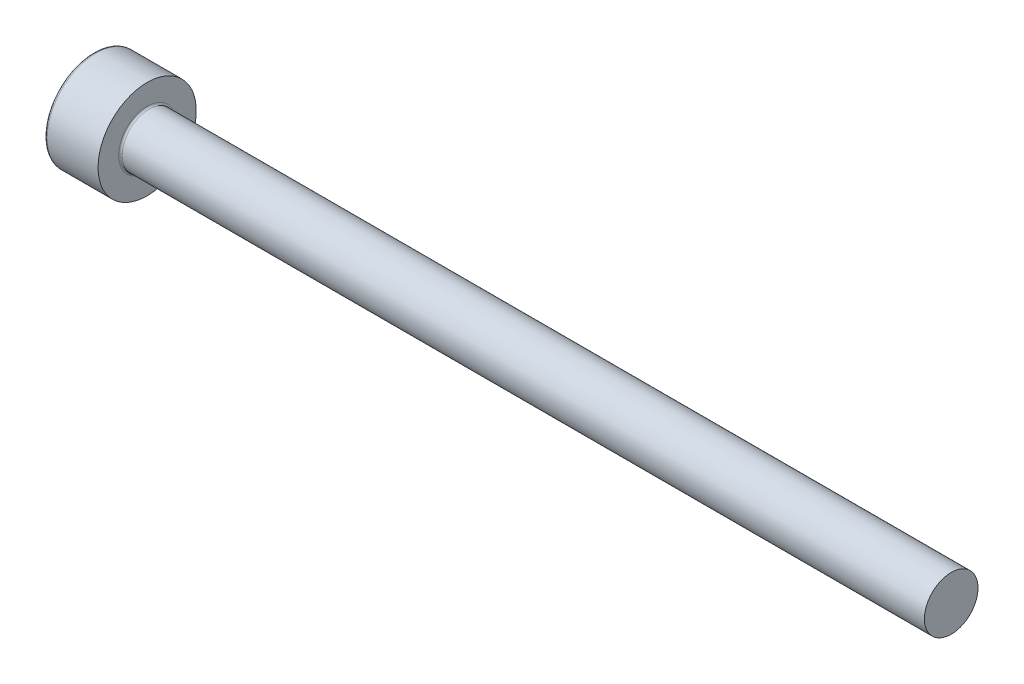
ISO-10303-21;
HEADER;
FILE_DESCRIPTION(('STEP AP214'),'2;1');
FILE_NAME('part.step','',(''),(''),'','','');
FILE_SCHEMA(('AUTOMOTIVE_DESIGN { 1 0 10303 214 1 1 1 1 }'));
ENDSEC;
DATA;
#1=APPLICATION_CONTEXT('core data for automotive mechanical design processes');
#2=APPLICATION_PROTOCOL_DEFINITION('international standard','automotive_design',2000,#1);
#3=PRODUCT_CONTEXT('',#1,'mechanical');
#4=PRODUCT('Part','Part','',(#3));
#5=PRODUCT_RELATED_PRODUCT_CATEGORY('part','',(#4));
#6=PRODUCT_DEFINITION_FORMATION('','',#4);
#7=PRODUCT_DEFINITION_CONTEXT('part definition',#1,'design');
#8=PRODUCT_DEFINITION('design','',#6,#7);
#9=PRODUCT_DEFINITION_SHAPE('','',#8);
#10=(LENGTH_UNIT() NAMED_UNIT(*) SI_UNIT(.MILLI.,.METRE.));
#11=(NAMED_UNIT(*) PLANE_ANGLE_UNIT() SI_UNIT($,.RADIAN.));
#12=(NAMED_UNIT(*) SI_UNIT($,.STERADIAN.) SOLID_ANGLE_UNIT());
#13=UNCERTAINTY_MEASURE_WITH_UNIT(LENGTH_MEASURE(1.E-05),#10,'distance_accuracy_value','');
#14=(GEOMETRIC_REPRESENTATION_CONTEXT(3) GLOBAL_UNCERTAINTY_ASSIGNED_CONTEXT((#13)) GLOBAL_UNIT_ASSIGNED_CONTEXT((#10,
#11,#12)) REPRESENTATION_CONTEXT('',''));
#15=CARTESIAN_POINT('',(0.,0.,0.));
#16=DIRECTION('',(0.,0.,1.));
#17=DIRECTION('',(1.,0.,0.));
#18=AXIS2_PLACEMENT_3D('',#15,#16,#17);
#19=CARTESIAN_POINT('',(-64.4045928047759,8.79516449896665,-40.4453986422559));
#20=DIRECTION('',(-1.,0.,0.));
#21=DIRECTION('',(0.,0.,1.));
#22=AXIS2_PLACEMENT_3D('',#19,#20,#21);
#23=CYLINDRICAL_SURFACE('',#22,1.49999999999999);
#24=CARTESIAN_POINT('',(-29.5545928047759,8.79516449896665,-40.4453986422559));
#25=DIRECTION('',(1.,0.,0.));
#26=DIRECTION('',(0.,0.,-1.));
#27=AXIS2_PLACEMENT_3D('',#24,#25,#26);
#28=CIRCLE('',#27,1.49999999999999);
#29=CARTESIAN_POINT('',(-29.5545928047759,8.79516449896665,-41.9453986422559));
#30=VERTEX_POINT('',#29);
#31=EDGE_CURVE('E147',#30,#30,#28,.T.);
#32=ORIENTED_EDGE('',*,*,#31,.T.);
#33=EDGE_LOOP('',(#32));
#34=FACE_BOUND('',#33,.T.);
#35=CARTESIAN_POINT('',(15.3454071952241,8.79516449896665,-40.4453986422559));
#36=DIRECTION('',(1.,0.,0.));
#37=DIRECTION('',(0.,0.,-1.));
#38=AXIS2_PLACEMENT_3D('',#35,#36,#37);
#39=CIRCLE('',#38,1.49999999999999);
#40=CARTESIAN_POINT('',(15.3454071952241,8.79516449896665,-41.9453986422559));
#41=VERTEX_POINT('',#40);
#42=EDGE_CURVE('E12',#41,#41,#39,.F.);
#43=ORIENTED_EDGE('',*,*,#42,.T.);
#44=EDGE_LOOP('',(#43));
#45=FACE_BOUND('',#44,.T.);
#46=ADVANCED_FACE('F33',(#34,#45),#23,.T.);
#47=CARTESIAN_POINT('',(-32.6545928047759,8.79516449896665,-40.4453986422559));
#48=DIRECTION('',(-1.,0.,0.));
#49=DIRECTION('',(0.,0.,1.));
#50=AXIS2_PLACEMENT_3D('',#47,#48,#49);
#51=PLANE('',#50);
#52=DIRECTION('',(0.,-0.499999999999998,0.866025403784439));
#53=VECTOR('',#52,1.);
#54=CARTESIAN_POINT('',(-32.6545928047759,10.2731811880921,-40.4453986422559));
#55=LINE('',#54,#53);
#56=CARTESIAN_POINT('',(-32.6545928047759,10.2731811880921,-40.4453986422559));
#57=VERTEX_POINT('',#56);
#58=CARTESIAN_POINT('',(-32.6545928047759,9.53417284352937,-39.1653986422559));
#59=VERTEX_POINT('',#58);
#60=EDGE_CURVE('E258',#57,#59,#55,.T.);
#61=ORIENTED_EDGE('',*,*,#60,.T.);
#62=DIRECTION('',(0.,1.,0.));
#63=VECTOR('',#62,1.);
#64=CARTESIAN_POINT('',(-32.6545928047759,8.05615615440393,-39.1653986422559));
#65=LINE('',#64,#63);
#66=CARTESIAN_POINT('',(-32.6545928047759,8.05615615440393,-39.1653986422559));
#67=VERTEX_POINT('',#66);
#68=EDGE_CURVE('E129',#67,#59,#65,.T.);
#69=ORIENTED_EDGE('',*,*,#68,.F.);
#70=DIRECTION('',(0.,-0.500000000000001,-0.866025403784438));
#71=VECTOR('',#70,1.);
#72=CARTESIAN_POINT('',(-32.6545928047759,8.05615615440393,-39.1653986422559));
#73=LINE('',#72,#71);
#74=CARTESIAN_POINT('',(-32.6545928047759,7.31714780984121,-40.4453986422559));
#75=VERTEX_POINT('',#74);
#76=EDGE_CURVE('E261',#67,#75,#73,.T.);
#77=ORIENTED_EDGE('',*,*,#76,.T.);
#78=DIRECTION('',(0.,0.499999999999998,-0.866025403784439));
#79=VECTOR('',#78,1.);
#80=CARTESIAN_POINT('',(-32.6545928047759,7.31714780984121,-40.4453986422559));
#81=LINE('',#80,#79);
#82=CARTESIAN_POINT('',(-32.6545928047759,8.05615615440393,-41.7253986422559));
#83=VERTEX_POINT('',#82);
#84=EDGE_CURVE('E264',#75,#83,#81,.T.);
#85=ORIENTED_EDGE('',*,*,#84,.T.);
#86=DIRECTION('',(0.,-1.,0.));
#87=VECTOR('',#86,1.);
#88=CARTESIAN_POINT('',(-32.6545928047759,9.53417284352937,-41.7253986422559));
#89=LINE('',#88,#87);
#90=CARTESIAN_POINT('',(-32.6545928047759,9.53417284352937,-41.7253986422559));
#91=VERTEX_POINT('',#90);
#92=EDGE_CURVE('E267',#91,#83,#89,.T.);
#93=ORIENTED_EDGE('',*,*,#92,.F.);
#94=DIRECTION('',(0.,-0.500000000000001,-0.866025403784438));
#95=VECTOR('',#94,1.);
#96=CARTESIAN_POINT('',(-32.6545928047759,10.2731811880921,-40.4453986422559));
#97=LINE('',#96,#95);
#98=EDGE_CURVE('E124',#57,#91,#97,.T.);
#99=ORIENTED_EDGE('',*,*,#98,.F.);
#100=EDGE_LOOP('',(#61,#69,#77,#85,#93,#99));
#101=FACE_BOUND('',#100,.T.);
#102=CARTESIAN_POINT('',(-32.6545928047759,8.79516449896665,-40.4453986422559));
#103=DIRECTION('',(-1.,0.,0.));
#104=DIRECTION('',(0.,0.,1.));
#105=AXIS2_PLACEMENT_3D('',#102,#103,#104);
#106=CIRCLE('',#105,2.6);
#107=CARTESIAN_POINT('',(-32.6545928047759,8.79516449896665,-37.8453986422559));
#108=VERTEX_POINT('',#107);
#109=EDGE_CURVE('E150',#108,#108,#106,.T.);
#110=ORIENTED_EDGE('',*,*,#109,.T.);
#111=EDGE_LOOP('',(#110));
#112=FACE_BOUND('',#111,.T.);
#113=ADVANCED_FACE('F164',(#101,#112),#51,.T.);
#114=CARTESIAN_POINT('',(-64.4045928047759,8.79516449896665,-40.4453986422559));
#115=DIRECTION('',(-1.,0.,0.));
#116=DIRECTION('',(0.,0.,1.));
#117=AXIS2_PLACEMENT_3D('',#114,#115,#116);
#118=CYLINDRICAL_SURFACE('',#117,2.75);
#119=CARTESIAN_POINT('',(-32.5045928047759,8.79516449896665,-40.4453986422559));
#120=DIRECTION('',(-1.,0.,0.));
#121=DIRECTION('',(0.,0.,1.));
#122=AXIS2_PLACEMENT_3D('',#119,#120,#121);
#123=CIRCLE('',#122,2.75);
#124=CARTESIAN_POINT('',(-32.5045928047759,8.79516449896665,-37.6953986422559));
#125=VERTEX_POINT('',#124);
#126=EDGE_CURVE('E41',#125,#125,#123,.F.);
#127=ORIENTED_EDGE('',*,*,#126,.T.);
#128=EDGE_LOOP('',(#127));
#129=FACE_BOUND('',#128,.T.);
#130=CARTESIAN_POINT('',(-29.6545928047759,8.79516449896665,-40.4453986422559));
#131=DIRECTION('',(-1.,0.,0.));
#132=DIRECTION('',(0.,0.,1.));
#133=AXIS2_PLACEMENT_3D('',#130,#131,#132);
#134=CIRCLE('',#133,2.75);
#135=CARTESIAN_POINT('',(-29.6545928047759,8.79516449896665,-37.6953986422559));
#136=VERTEX_POINT('',#135);
#137=EDGE_CURVE('E140',#136,#136,#134,.T.);
#138=ORIENTED_EDGE('',*,*,#137,.T.);
#139=EDGE_LOOP('',(#138));
#140=FACE_BOUND('',#139,.T.);
#141=ADVANCED_FACE('F155',(#129,#140),#118,.T.);
#142=CARTESIAN_POINT('',(-29.6545928047759,11.5451644989667,-40.4453986422559));
#143=DIRECTION('',(1.,0.,0.));
#144=DIRECTION('',(0.,0.,-1.));
#145=AXIS2_PLACEMENT_3D('',#142,#143,#144);
#146=PLANE('',#145);
#147=CARTESIAN_POINT('',(-29.6545928047759,8.79516449896665,-40.4453986422559));
#148=DIRECTION('',(1.,0.,0.));
#149=DIRECTION('',(0.,0.,-1.));
#150=AXIS2_PLACEMENT_3D('',#147,#148,#149);
#151=CIRCLE('',#150,1.59999999999999);
#152=CARTESIAN_POINT('',(-29.6545928047759,8.79516449896665,-42.0453986422559));
#153=VERTEX_POINT('',#152);
#154=EDGE_CURVE('E144',#153,#153,#151,.F.);
#155=ORIENTED_EDGE('',*,*,#154,.T.);
#156=EDGE_LOOP('',(#155));
#157=FACE_BOUND('',#156,.T.);
#158=ORIENTED_EDGE('',*,*,#137,.F.);
#159=EDGE_LOOP('',(#158));
#160=FACE_BOUND('',#159,.T.);
#161=ADVANCED_FACE('F172',(#157,#160),#146,.T.);
#162=CARTESIAN_POINT('',(15.3454071952241,10.0146644989667,-40.4453986422559));
#163=DIRECTION('',(1.,0.,0.));
#164=DIRECTION('',(0.,0.,-1.));
#165=AXIS2_PLACEMENT_3D('',#162,#163,#164);
#166=PLANE('',#165);
#167=ORIENTED_EDGE('',*,*,#42,.F.);
#168=EDGE_LOOP('',(#167));
#169=FACE_BOUND('',#168,.T.);
#170=ADVANCED_FACE('F35',(#169),#166,.T.);
#171=CARTESIAN_POINT('',(-29.5545928047759,8.79516449896665,-40.4453986422559));
#172=DIRECTION('',(1.,0.,0.));
#173=DIRECTION('',(0.,0.,-1.));
#174=AXIS2_PLACEMENT_3D('',#171,#172,#173);
#175=TOROIDAL_SURFACE('',#174,1.59999999999999,0.1);
#176=ORIENTED_EDGE('',*,*,#31,.F.);
#177=EDGE_LOOP('',(#176));
#178=FACE_BOUND('',#177,.T.);
#179=ORIENTED_EDGE('',*,*,#154,.F.);
#180=EDGE_LOOP('',(#179));
#181=FACE_BOUND('',#180,.T.);
#182=ADVANCED_FACE('F161',(#178,#181),#175,.F.);
#183=CARTESIAN_POINT('',(-32.5045928047759,8.79516449896665,-40.4453986422559));
#184=DIRECTION('',(-1.,0.,0.));
#185=DIRECTION('',(0.,0.,1.));
#186=AXIS2_PLACEMENT_3D('',#183,#184,#185);
#187=TOROIDAL_SURFACE('',#186,2.6,0.15);
#188=ORIENTED_EDGE('',*,*,#126,.F.);
#189=EDGE_LOOP('',(#188));
#190=FACE_BOUND('',#189,.T.);
#191=ORIENTED_EDGE('',*,*,#109,.F.);
#192=EDGE_LOOP('',(#191));
#193=FACE_BOUND('',#192,.T.);
#194=ADVANCED_FACE('F158',(#190,#193),#187,.T.);
#195=CARTESIAN_POINT('',(-31.3545928047759,10.2731811880921,-40.4453986422559));
#196=DIRECTION('',(0.,-0.86602540378444,-0.499999999999998));
#197=DIRECTION('',(0.,0.499999999999998,-0.86602540378444));
#198=AXIS2_PLACEMENT_3D('',#195,#196,#197);
#199=PLANE('',#198);
#200=ORIENTED_EDGE('',*,*,#60,.F.);
#201=DIRECTION('',(-1.,0.,0.));
#202=VECTOR('',#201,1.);
#203=CARTESIAN_POINT('',(-31.3545928047759,10.2731811880921,-40.4453986422559));
#204=LINE('',#203,#202);
#205=CARTESIAN_POINT('',(-31.3545928047759,10.2731811880921,-40.4453986422559));
#206=VERTEX_POINT('',#205);
#207=EDGE_CURVE('E248',#206,#57,#204,.T.);
#208=ORIENTED_EDGE('',*,*,#207,.F.);
#209=DIRECTION('',(0.,-0.499999999999998,0.866025403784439));
#210=VECTOR('',#209,1.);
#211=CARTESIAN_POINT('',(-31.3545928047759,10.2731811880921,-40.4453986422559));
#212=LINE('',#211,#210);
#213=CARTESIAN_POINT('',(-31.3545928047759,9.90367701581073,-39.8053986422559));
#214=VERTEX_POINT('',#213);
#215=EDGE_CURVE('E116',#206,#214,#212,.T.);
#216=ORIENTED_EDGE('',*,*,#215,.T.);
#217=CARTESIAN_POINT('',(-31.3545928047759,9.53417284352937,-39.1653986422559));
#218=VERTEX_POINT('',#217);
#219=EDGE_CURVE('E107',#214,#218,#212,.T.);
#220=ORIENTED_EDGE('',*,*,#219,.T.);
#221=DIRECTION('',(-1.,0.,0.));
#222=VECTOR('',#221,1.);
#223=CARTESIAN_POINT('',(-31.3545928047759,9.53417284352937,-39.1653986422559));
#224=LINE('',#223,#222);
#225=EDGE_CURVE('E121',#218,#59,#224,.T.);
#226=ORIENTED_EDGE('',*,*,#225,.T.);
#227=EDGE_LOOP('',(#200,#208,#216,#220,#226));
#228=FACE_BOUND('',#227,.T.);
#229=ADVANCED_FACE('F120',(#228),#199,.T.);
#230=CARTESIAN_POINT('',(-31.3545928047759,8.05615615440393,-39.1653986422559));
#231=DIRECTION('',(0.,0.,1.));
#232=DIRECTION('',(0.,-1.,0.));
#233=AXIS2_PLACEMENT_3D('',#230,#231,#232);
#234=PLANE('',#233);
#235=ORIENTED_EDGE('',*,*,#68,.T.);
#236=ORIENTED_EDGE('',*,*,#225,.F.);
#237=DIRECTION('',(0.,1.,0.));
#238=VECTOR('',#237,1.);
#239=CARTESIAN_POINT('',(-31.3545928047759,8.05615615440393,-39.1653986422559));
#240=LINE('',#239,#238);
#241=CARTESIAN_POINT('',(-31.3545928047759,8.79516449896665,-39.1653986422559));
#242=VERTEX_POINT('',#241);
#243=EDGE_CURVE('E104',#242,#218,#240,.T.);
#244=ORIENTED_EDGE('',*,*,#243,.F.);
#245=CARTESIAN_POINT('',(-31.3545928047759,8.05615615440393,-39.1653986422559));
#246=VERTEX_POINT('',#245);
#247=EDGE_CURVE('E115',#246,#242,#240,.T.);
#248=ORIENTED_EDGE('',*,*,#247,.F.);
#249=DIRECTION('',(-1.,0.,0.));
#250=VECTOR('',#249,1.);
#251=CARTESIAN_POINT('',(-31.3545928047759,8.05615615440393,-39.1653986422559));
#252=LINE('',#251,#250);
#253=EDGE_CURVE('E131',#246,#67,#252,.T.);
#254=ORIENTED_EDGE('',*,*,#253,.T.);
#255=EDGE_LOOP('',(#235,#236,#244,#248,#254));
#256=FACE_BOUND('',#255,.T.);
#257=ADVANCED_FACE('F126',(#256),#234,.F.);
#258=CARTESIAN_POINT('',(-31.3545928047759,8.05615615440393,-39.1653986422559));
#259=DIRECTION('',(0.,0.866025403784438,-0.500000000000001));
#260=DIRECTION('',(0.,0.500000000000001,0.866025403784438));
#261=AXIS2_PLACEMENT_3D('',#258,#259,#260);
#262=PLANE('',#261);
#263=ORIENTED_EDGE('',*,*,#76,.F.);
#264=ORIENTED_EDGE('',*,*,#253,.F.);
#265=DIRECTION('',(0.,-0.500000000000001,-0.866025403784438));
#266=VECTOR('',#265,1.);
#267=CARTESIAN_POINT('',(-31.3545928047759,8.05615615440393,-39.1653986422559));
#268=LINE('',#267,#266);
#269=CARTESIAN_POINT('',(-31.3545928047759,7.68665198212257,-39.8053986422559));
#270=VERTEX_POINT('',#269);
#271=EDGE_CURVE('E287',#246,#270,#268,.T.);
#272=ORIENTED_EDGE('',*,*,#271,.T.);
#273=CARTESIAN_POINT('',(-31.3545928047759,7.31714780984121,-40.4453986422559));
#274=VERTEX_POINT('',#273);
#275=EDGE_CURVE('E276',#270,#274,#268,.T.);
#276=ORIENTED_EDGE('',*,*,#275,.T.);
#277=DIRECTION('',(-1.,0.,0.));
#278=VECTOR('',#277,1.);
#279=CARTESIAN_POINT('',(-31.3545928047759,7.31714780984121,-40.4453986422559));
#280=LINE('',#279,#278);
#281=EDGE_CURVE('E136',#274,#75,#280,.T.);
#282=ORIENTED_EDGE('',*,*,#281,.T.);
#283=EDGE_LOOP('',(#263,#264,#272,#276,#282));
#284=FACE_BOUND('',#283,.T.);
#285=ADVANCED_FACE('F202',(#284),#262,.T.);
#286=CARTESIAN_POINT('',(-31.3545928047759,7.31714780984121,-40.4453986422559));
#287=DIRECTION('',(0.,0.86602540378444,0.499999999999998));
#288=DIRECTION('',(0.,-0.499999999999998,0.86602540378444));
#289=AXIS2_PLACEMENT_3D('',#286,#287,#288);
#290=PLANE('',#289);
#291=ORIENTED_EDGE('',*,*,#84,.F.);
#292=ORIENTED_EDGE('',*,*,#281,.F.);
#293=DIRECTION('',(0.,0.499999999999998,-0.866025403784439));
#294=VECTOR('',#293,1.);
#295=CARTESIAN_POINT('',(-31.3545928047759,7.31714780984121,-40.4453986422559));
#296=LINE('',#295,#294);
#297=CARTESIAN_POINT('',(-31.3545928047759,7.68665198212257,-41.0853986422559));
#298=VERTEX_POINT('',#297);
#299=EDGE_CURVE('E254',#274,#298,#296,.T.);
#300=ORIENTED_EDGE('',*,*,#299,.T.);
#301=CARTESIAN_POINT('',(-31.3545928047759,8.05615615440393,-41.7253986422559));
#302=VERTEX_POINT('',#301);
#303=EDGE_CURVE('E286',#298,#302,#296,.T.);
#304=ORIENTED_EDGE('',*,*,#303,.T.);
#305=DIRECTION('',(-1.,0.,0.));
#306=VECTOR('',#305,1.);
#307=CARTESIAN_POINT('',(-31.3545928047759,8.05615615440393,-41.7253986422559));
#308=LINE('',#307,#306);
#309=EDGE_CURVE('E247',#302,#83,#308,.T.);
#310=ORIENTED_EDGE('',*,*,#309,.T.);
#311=EDGE_LOOP('',(#291,#292,#300,#304,#310));
#312=FACE_BOUND('',#311,.T.);
#313=ADVANCED_FACE('F205',(#312),#290,.T.);
#314=CARTESIAN_POINT('',(-31.3545928047759,9.53417284352937,-41.7253986422559));
#315=DIRECTION('',(0.,0.,-1.));
#316=DIRECTION('',(0.,1.,0.));
#317=AXIS2_PLACEMENT_3D('',#314,#315,#316);
#318=PLANE('',#317);
#319=ORIENTED_EDGE('',*,*,#92,.T.);
#320=ORIENTED_EDGE('',*,*,#309,.F.);
#321=DIRECTION('',(0.,-1.,0.));
#322=VECTOR('',#321,1.);
#323=CARTESIAN_POINT('',(-31.3545928047759,9.53417284352937,-41.7253986422559));
#324=LINE('',#323,#322);
#325=CARTESIAN_POINT('',(-31.3545928047759,8.79516449896665,-41.7253986422559));
#326=VERTEX_POINT('',#325);
#327=EDGE_CURVE('E251',#326,#302,#324,.T.);
#328=ORIENTED_EDGE('',*,*,#327,.F.);
#329=CARTESIAN_POINT('',(-31.3545928047759,9.53417284352937,-41.7253986422559));
#330=VERTEX_POINT('',#329);
#331=EDGE_CURVE('E48',#330,#326,#324,.T.);
#332=ORIENTED_EDGE('',*,*,#331,.F.);
#333=DIRECTION('',(-1.,0.,0.));
#334=VECTOR('',#333,1.);
#335=CARTESIAN_POINT('',(-31.3545928047759,9.53417284352937,-41.7253986422559));
#336=LINE('',#335,#334);
#337=EDGE_CURVE('E244',#330,#91,#336,.T.);
#338=ORIENTED_EDGE('',*,*,#337,.T.);
#339=EDGE_LOOP('',(#319,#320,#328,#332,#338));
#340=FACE_BOUND('',#339,.T.);
#341=ADVANCED_FACE('F209',(#340),#318,.F.);
#342=CARTESIAN_POINT('',(-31.3545928047759,10.2731811880921,-40.4453986422559));
#343=DIRECTION('',(0.,0.866025403784438,-0.500000000000001));
#344=DIRECTION('',(0.,0.500000000000001,0.866025403784438));
#345=AXIS2_PLACEMENT_3D('',#342,#343,#344);
#346=PLANE('',#345);
#347=ORIENTED_EDGE('',*,*,#98,.T.);
#348=ORIENTED_EDGE('',*,*,#337,.F.);
#349=DIRECTION('',(0.,-0.500000000000001,-0.866025403784438));
#350=VECTOR('',#349,1.);
#351=CARTESIAN_POINT('',(-31.3545928047759,10.2731811880921,-40.4453986422559));
#352=LINE('',#351,#350);
#353=CARTESIAN_POINT('',(-31.3545928047759,9.90367701581073,-41.0853986422559));
#354=VERTEX_POINT('',#353);
#355=EDGE_CURVE('E234',#354,#330,#352,.T.);
#356=ORIENTED_EDGE('',*,*,#355,.F.);
#357=EDGE_CURVE('E240',#206,#354,#352,.T.);
#358=ORIENTED_EDGE('',*,*,#357,.F.);
#359=ORIENTED_EDGE('',*,*,#207,.T.);
#360=EDGE_LOOP('',(#347,#348,#356,#358,#359));
#361=FACE_BOUND('',#360,.T.);
#362=ADVANCED_FACE('F213',(#361),#346,.F.);
#363=CARTESIAN_POINT('',(-31.3545928047759,11.0121895326548,-41.7253986422559));
#364=DIRECTION('',(1.,0.,0.));
#365=DIRECTION('',(0.,0.,-1.));
#366=AXIS2_PLACEMENT_3D('',#363,#364,#365);
#367=PLANE('',#366);
#368=ORIENTED_EDGE('',*,*,#327,.T.);
#369=ORIENTED_EDGE('',*,*,#303,.F.);
#370=CARTESIAN_POINT('',(-31.3545928047759,8.79516449896665,-40.4453986422559));
#371=DIRECTION('',(-1.,0.,0.));
#372=DIRECTION('',(0.,0.,1.));
#373=AXIS2_PLACEMENT_3D('',#370,#371,#372);
#374=CIRCLE('',#373,1.28);
#375=EDGE_CURVE('E282',#326,#298,#374,.T.);
#376=ORIENTED_EDGE('',*,*,#375,.F.);
#377=EDGE_LOOP('',(#368,#369,#376));
#378=FACE_BOUND('',#377,.T.);
#379=ADVANCED_FACE('F217',(#378),#367,.F.);
#380=ORIENTED_EDGE('',*,*,#299,.F.);
#381=ORIENTED_EDGE('',*,*,#275,.F.);
#382=EDGE_CURVE('E134',#298,#270,#374,.T.);
#383=ORIENTED_EDGE('',*,*,#382,.F.);
#384=EDGE_LOOP('',(#380,#381,#383));
#385=FACE_BOUND('',#384,.T.);
#386=ADVANCED_FACE('F220',(#385),#367,.F.);
#387=ORIENTED_EDGE('',*,*,#271,.F.);
#388=ORIENTED_EDGE('',*,*,#247,.T.);
#389=EDGE_CURVE('E130',#270,#242,#374,.T.);
#390=ORIENTED_EDGE('',*,*,#389,.F.);
#391=EDGE_LOOP('',(#387,#388,#390));
#392=FACE_BOUND('',#391,.T.);
#393=ADVANCED_FACE('F225',(#392),#367,.F.);
#394=ORIENTED_EDGE('',*,*,#243,.T.);
#395=ORIENTED_EDGE('',*,*,#219,.F.);
#396=EDGE_CURVE('E110',#242,#214,#374,.T.);
#397=ORIENTED_EDGE('',*,*,#396,.F.);
#398=EDGE_LOOP('',(#394,#395,#397));
#399=FACE_BOUND('',#398,.T.);
#400=ADVANCED_FACE('F106',(#399),#367,.F.);
#401=ORIENTED_EDGE('',*,*,#215,.F.);
#402=ORIENTED_EDGE('',*,*,#357,.T.);
#403=EDGE_CURVE('E141',#214,#354,#374,.T.);
#404=ORIENTED_EDGE('',*,*,#403,.F.);
#405=EDGE_LOOP('',(#401,#402,#404));
#406=FACE_BOUND('',#405,.T.);
#407=ADVANCED_FACE('F228',(#406),#367,.F.);
#408=ORIENTED_EDGE('',*,*,#355,.T.);
#409=ORIENTED_EDGE('',*,*,#331,.T.);
#410=EDGE_CURVE('E237',#354,#326,#374,.T.);
#411=ORIENTED_EDGE('',*,*,#410,.F.);
#412=EDGE_LOOP('',(#408,#409,#411));
#413=FACE_BOUND('',#412,.T.);
#414=ADVANCED_FACE('F197',(#413),#367,.F.);
#415=CARTESIAN_POINT('',(-31.3545928047759,8.79516449896665,-40.4453986422559));
#416=DIRECTION('',(-1.,0.,0.));
#417=DIRECTION('',(0.,0.,1.));
#418=AXIS2_PLACEMENT_3D('',#415,#416,#417);
#419=CONICAL_SURFACE('',#418,1.28,1.04719755119659);
#420=CARTESIAN_POINT('',(-30.6155844602132,8.79516449896665,-40.4453986422559));
#421=VERTEX_POINT('',#420);
#422=VERTEX_LOOP('',#421);
#423=FACE_BOUND('',#422,.T.);
#424=ORIENTED_EDGE('',*,*,#396,.T.);
#425=ORIENTED_EDGE('',*,*,#403,.T.);
#426=ORIENTED_EDGE('',*,*,#410,.T.);
#427=ORIENTED_EDGE('',*,*,#375,.T.);
#428=ORIENTED_EDGE('',*,*,#382,.T.);
#429=ORIENTED_EDGE('',*,*,#389,.T.);
#430=EDGE_LOOP('',(#424,#425,#426,#427,#428,#429));
#431=FACE_BOUND('',#430,.T.);
#432=ADVANCED_FACE('F194',(#423,#431),#419,.F.);
#433=CLOSED_SHELL('',(#46,#113,#141,#161,#170,#182,#194,#229,#257,#285,#313,#341,#362,#379,#386,
#393,#400,#407,#414,#432));
#434=MANIFOLD_SOLID_BREP('B2',#433);
#435=ADVANCED_BREP_SHAPE_REPRESENTATION('',(#18,#434),#14);
#436=SHAPE_DEFINITION_REPRESENTATION(#9,#435);
ENDSEC;
END-ISO-10303-21;
